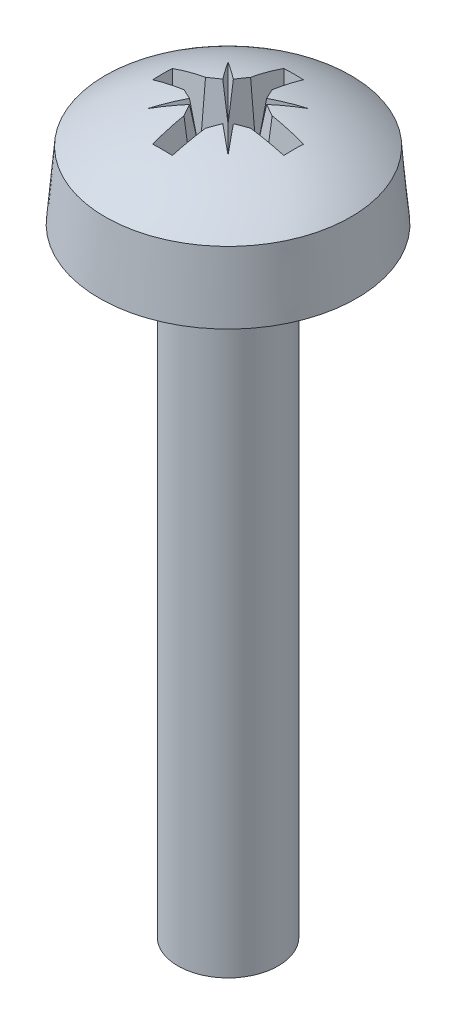
ISO-10303-21;
HEADER;
FILE_DESCRIPTION(('STEP AP214'),'2;1');
FILE_NAME('part.step','',(''),(''),'','','');
FILE_SCHEMA(('AUTOMOTIVE_DESIGN { 1 0 10303 214 1 1 1 1 }'));
ENDSEC;
DATA;
#1=APPLICATION_CONTEXT('core data for automotive mechanical design processes');
#2=APPLICATION_PROTOCOL_DEFINITION('international standard','automotive_design',2000,#1);
#3=PRODUCT_CONTEXT('',#1,'mechanical');
#4=PRODUCT('Part','Part','',(#3));
#5=PRODUCT_RELATED_PRODUCT_CATEGORY('part','',(#4));
#6=PRODUCT_DEFINITION_FORMATION('','',#4);
#7=PRODUCT_DEFINITION_CONTEXT('part definition',#1,'design');
#8=PRODUCT_DEFINITION('design','',#6,#7);
#9=PRODUCT_DEFINITION_SHAPE('','',#8);
#10=(LENGTH_UNIT() NAMED_UNIT(*) SI_UNIT(.MILLI.,.METRE.));
#11=(NAMED_UNIT(*) PLANE_ANGLE_UNIT() SI_UNIT($,.RADIAN.));
#12=(NAMED_UNIT(*) SI_UNIT($,.STERADIAN.) SOLID_ANGLE_UNIT());
#13=UNCERTAINTY_MEASURE_WITH_UNIT(LENGTH_MEASURE(1.E-05),#10,'distance_accuracy_value','');
#14=(GEOMETRIC_REPRESENTATION_CONTEXT(3) GLOBAL_UNCERTAINTY_ASSIGNED_CONTEXT((#13)) GLOBAL_UNIT_ASSIGNED_CONTEXT((#10,
#11,#12)) REPRESENTATION_CONTEXT('',''));
#15=CARTESIAN_POINT('',(0.,0.,0.));
#16=DIRECTION('',(0.,0.,1.));
#17=DIRECTION('',(1.,0.,0.));
#18=AXIS2_PLACEMENT_3D('',#15,#16,#17);
#19=CARTESIAN_POINT('',(0.974000000000002,-12.,0.));
#20=DIRECTION('',(0.,1.,0.));
#21=DIRECTION('',(-1.,0.,0.));
#22=AXIS2_PLACEMENT_3D('',#19,#20,#21);
#23=PLANE('',#22);
#24=CARTESIAN_POINT('',(0.,-12.,0.));
#25=DIRECTION('',(0.,1.,0.));
#26=DIRECTION('',(-1.,0.,0.));
#27=AXIS2_PLACEMENT_3D('',#24,#25,#26);
#28=CIRCLE('',#27,0.974);
#29=CARTESIAN_POINT('',(-0.973999999999997,-12.,0.));
#30=VERTEX_POINT('',#29);
#31=EDGE_CURVE('E307',#30,#30,#28,.T.);
#32=ORIENTED_EDGE('',*,*,#31,.F.);
#33=EDGE_LOOP('',(#32));
#34=FACE_BOUND('',#33,.T.);
#35=ADVANCED_FACE('F37',(#34),#23,.F.);
#36=CARTESIAN_POINT('',(0.,2.1,0.));
#37=DIRECTION('',(0.,1.,0.));
#38=DIRECTION('',(-1.,0.,0.));
#39=AXIS2_PLACEMENT_3D('',#36,#37,#38);
#40=CYLINDRICAL_SURFACE('',#39,0.974);
#41=CARTESIAN_POINT('',(0.,-0.900000000000001,0.));
#42=DIRECTION('',(0.,1.,0.));
#43=DIRECTION('',(-1.,0.,0.));
#44=AXIS2_PLACEMENT_3D('',#41,#42,#43);
#45=CIRCLE('',#44,0.974);
#46=CARTESIAN_POINT('',(-0.974,-0.900000000000001,0.));
#47=VERTEX_POINT('',#46);
#48=EDGE_CURVE('E304',#47,#47,#45,.T.);
#49=ORIENTED_EDGE('',*,*,#48,.F.);
#50=EDGE_LOOP('',(#49));
#51=FACE_BOUND('',#50,.T.);
#52=ORIENTED_EDGE('',*,*,#31,.T.);
#53=EDGE_LOOP('',(#52));
#54=FACE_BOUND('',#53,.T.);
#55=ADVANCED_FACE('F552',(#51,#54),#40,.T.);
#56=CARTESIAN_POINT('',(0.,-0.900000000000001,0.));
#57=DIRECTION('',(0.,1.,0.));
#58=DIRECTION('',(-1.,0.,0.));
#59=AXIS2_PLACEMENT_3D('',#56,#57,#58);
#60=CONICAL_SURFACE('',#59,0.974,0.296149679839105);
#61=CARTESIAN_POINT('',(0.,-0.00200000000000113,0.));
#62=DIRECTION('',(0.,1.,0.));
#63=DIRECTION('',(-1.,0.,0.));
#64=AXIS2_PLACEMENT_3D('',#61,#62,#63);
#65=CIRCLE('',#64,1.248);
#66=CARTESIAN_POINT('',(-1.248,-0.00200000000000136,0.));
#67=VERTEX_POINT('',#66);
#68=EDGE_CURVE('E301',#67,#67,#65,.T.);
#69=ORIENTED_EDGE('',*,*,#68,.F.);
#70=EDGE_LOOP('',(#69));
#71=FACE_BOUND('',#70,.T.);
#72=ORIENTED_EDGE('',*,*,#48,.T.);
#73=EDGE_LOOP('',(#72));
#74=FACE_BOUND('',#73,.T.);
#75=ADVANCED_FACE('F557',(#71,#74),#60,.T.);
#76=CARTESIAN_POINT('',(1.25,-0.00200000000000087,0.));
#77=DIRECTION('',(0.,1.,0.));
#78=DIRECTION('',(-1.,0.,0.));
#79=AXIS2_PLACEMENT_3D('',#76,#77,#78);
#80=PLANE('',#79);
#81=CARTESIAN_POINT('',(0.,-0.00200000000000113,0.));
#82=DIRECTION('',(0.,1.,0.));
#83=DIRECTION('',(-1.,0.,0.));
#84=AXIS2_PLACEMENT_3D('',#81,#82,#83);
#85=CIRCLE('',#84,1.25);
#86=CARTESIAN_POINT('',(-1.25,-0.00200000000000136,0.));
#87=VERTEX_POINT('',#86);
#88=EDGE_CURVE('E298',#87,#87,#85,.T.);
#89=ORIENTED_EDGE('',*,*,#88,.F.);
#90=EDGE_LOOP('',(#89));
#91=FACE_BOUND('',#90,.T.);
#92=ORIENTED_EDGE('',*,*,#68,.T.);
#93=EDGE_LOOP('',(#92));
#94=FACE_BOUND('',#93,.T.);
#95=ADVANCED_FACE('F564',(#91,#94),#80,.F.);
#96=CARTESIAN_POINT('',(0.,2.1,0.));
#97=DIRECTION('',(0.,1.,0.));
#98=DIRECTION('',(-1.,0.,0.));
#99=AXIS2_PLACEMENT_3D('',#96,#97,#98);
#100=CYLINDRICAL_SURFACE('',#99,1.25);
#101=CARTESIAN_POINT('',(0.,0.,0.));
#102=DIRECTION('',(0.,1.,0.));
#103=DIRECTION('',(-1.,0.,0.));
#104=AXIS2_PLACEMENT_3D('',#101,#102,#103);
#105=CIRCLE('',#104,1.25);
#106=CARTESIAN_POINT('',(-1.25,0.,0.));
#107=VERTEX_POINT('',#106);
#108=EDGE_CURVE('E295',#107,#107,#105,.T.);
#109=ORIENTED_EDGE('',*,*,#108,.F.);
#110=EDGE_LOOP('',(#109));
#111=FACE_BOUND('',#110,.T.);
#112=ORIENTED_EDGE('',*,*,#88,.T.);
#113=EDGE_LOOP('',(#112));
#114=FACE_BOUND('',#113,.T.);
#115=ADVANCED_FACE('F571',(#111,#114),#100,.T.);
#116=CARTESIAN_POINT('',(2.5,0.,0.));
#117=DIRECTION('',(0.,1.,0.));
#118=DIRECTION('',(-1.,0.,0.));
#119=AXIS2_PLACEMENT_3D('',#116,#117,#118);
#120=PLANE('',#119);
#121=CARTESIAN_POINT('',(0.,0.,0.));
#122=DIRECTION('',(0.,1.,0.));
#123=DIRECTION('',(-1.,0.,0.));
#124=AXIS2_PLACEMENT_3D('',#121,#122,#123);
#125=CIRCLE('',#124,2.5);
#126=CARTESIAN_POINT('',(-2.5,0.,0.));
#127=VERTEX_POINT('',#126);
#128=EDGE_CURVE('E292',#127,#127,#125,.T.);
#129=ORIENTED_EDGE('',*,*,#128,.F.);
#130=EDGE_LOOP('',(#129));
#131=FACE_BOUND('',#130,.T.);
#132=ORIENTED_EDGE('',*,*,#108,.T.);
#133=EDGE_LOOP('',(#132));
#134=FACE_BOUND('',#133,.T.);
#135=ADVANCED_FACE('F575',(#131,#134),#120,.F.);
#136=CARTESIAN_POINT('',(0.,0.,0.));
#137=DIRECTION('',(0.,-1.,0.));
#138=DIRECTION('',(1.,0.,0.));
#139=AXIS2_PLACEMENT_3D('',#136,#137,#138);
#140=CONICAL_SURFACE('',#139,2.5,0.0872664625997159);
#141=CARTESIAN_POINT('',(0.,1.31096863090063,0.));
#142=DIRECTION('',(0.,1.,0.));
#143=DIRECTION('',(-1.,0.,0.));
#144=AXIS2_PLACEMENT_3D('',#141,#142,#143);
#145=CIRCLE('',#144,2.38530510655809);
#146=CARTESIAN_POINT('',(-2.38530510655809,1.31096863090063,0.));
#147=VERTEX_POINT('',#146);
#148=EDGE_CURVE('E289',#147,#147,#145,.T.);
#149=ORIENTED_EDGE('',*,*,#148,.F.);
#150=EDGE_LOOP('',(#149));
#151=FACE_BOUND('',#150,.T.);
#152=ORIENTED_EDGE('',*,*,#128,.T.);
#153=EDGE_LOOP('',(#152));
#154=FACE_BOUND('',#153,.T.);
#155=ADVANCED_FACE('F579',(#151,#154),#140,.T.);
#156=CARTESIAN_POINT('',(0.,-1.9,0.));
#157=DIRECTION('',(0.,1.,0.));
#158=DIRECTION('',(1.,0.,0.));
#159=AXIS2_PLACEMENT_3D('',#156,#157,#158);
#160=SPHERICAL_SURFACE('',#159,4.);
#161=CARTESIAN_POINT('',(-0.00278354721914485,-1.89923902999755,0.0055373415829533));
#162=DIRECTION('',(0.445785078048498,-0.121869343405148,-0.886805236411746));
#163=DIRECTION('',(-0.893464988953191,0.,-0.449132846176801));
#164=AXIS2_PLACEMENT_3D('',#161,#162,#163);
#165=CIRCLE('',#164,3.99999512632675);
#166=CARTESIAN_POINT('',(0.426300530005417,2.06404659813842,-0.323422982956247));
#167=VERTEX_POINT('',#166);
#168=CARTESIAN_POINT('',(0.647136075268145,2.04174941228099,-0.209347727164586));
#169=VERTEX_POINT('',#168);
#170=EDGE_CURVE('E310',#167,#169,#165,.T.);
#171=ORIENTED_EDGE('',*,*,#170,.T.);
#172=CARTESIAN_POINT('',(0.,-1.86677949775066,0.27055927882996));
#173=DIRECTION('',(0.,-0.121869343405148,-0.992546151641322));
#174=DIRECTION('',(0.,0.992546151641322,-0.121869343405148));
#175=AXIS2_PLACEMENT_3D('',#172,#173,#174);
#176=CIRCLE('',#175,3.99070095031804);
#177=CARTESIAN_POINT('',(1.27384244930078,1.88696384539826,-0.190342449300782));
#178=VERTEX_POINT('',#177);
#179=EDGE_CURVE('E11',#169,#178,#176,.T.);
#180=ORIENTED_EDGE('',*,*,#179,.T.);
#181=CARTESIAN_POINT('',(0.796848430880061,-1.99784068469178,0.));
#182=DIRECTION('',(0.992546151641322,-0.121869343405148,0.));
#183=DIRECTION('',(0.121869343405148,0.992546151641322,0.));
#184=AXIS2_PLACEMENT_3D('',#181,#182,#183);
#185=CIRCLE('',#184,3.91860431513862);
#186=CARTESIAN_POINT('',(1.27384244930078,1.88696384539826,0.19034244930078));
#187=VERTEX_POINT('',#186);
#188=EDGE_CURVE('E44',#178,#187,#185,.T.);
#189=ORIENTED_EDGE('',*,*,#188,.T.);
#190=CARTESIAN_POINT('',(0.,-1.86677949775066,-0.270559278829959));
#191=DIRECTION('',(0.,-0.121869343405148,0.992546151641322));
#192=DIRECTION('',(0.,-0.992546151641322,-0.121869343405148));
#193=AXIS2_PLACEMENT_3D('',#190,#191,#192);
#194=CIRCLE('',#193,3.99070095031804);
#195=CARTESIAN_POINT('',(0.647136075268145,2.04174941228099,0.209347727164585));
#196=VERTEX_POINT('',#195);
#197=EDGE_CURVE('E385',#187,#196,#194,.T.);
#198=ORIENTED_EDGE('',*,*,#197,.T.);
#199=CARTESIAN_POINT('',(-0.00278354721914501,-1.89923902999755,-0.00553734158295361));
#200=DIRECTION('',(0.445785078048498,-0.121869343405148,0.886805236411746));
#201=DIRECTION('',(0.893464988953191,0.,-0.449132846176801));
#202=AXIS2_PLACEMENT_3D('',#199,#200,#201);
#203=CIRCLE('',#202,3.99999512632675);
#204=CARTESIAN_POINT('',(0.426300530005417,2.06404659813842,0.323422982956247));
#205=VERTEX_POINT('',#204);
#206=EDGE_CURVE('E382',#196,#205,#203,.T.);
#207=ORIENTED_EDGE('',*,*,#206,.T.);
#208=CARTESIAN_POINT('',(-0.275654934070824,-1.856277679116,0.225420166907371));
#209=DIRECTION('',(0.768346353587388,-0.121869343405148,-0.628324553130755));
#210=DIRECTION('',(-0.633043160856276,0.,-0.774116500594772));
#211=AXIS2_PLACEMENT_3D('',#208,#209,#210);
#212=CIRCLE('',#211,3.98387857048008);
#213=CARTESIAN_POINT('',(0.78313145032651,1.9436194222398,0.783131450326509));
#214=VERTEX_POINT('',#213);
#215=EDGE_CURVE('E379',#205,#214,#212,.T.);
#216=ORIENTED_EDGE('',*,*,#215,.T.);
#217=CARTESIAN_POINT('',(0.225420166907368,-1.856277679116,-0.275654934070822));
#218=DIRECTION('',(-0.628324553130752,-0.121869343405148,0.76834635358739));
#219=DIRECTION('',(0.774116500594774,0.,0.633043160856273));
#220=AXIS2_PLACEMENT_3D('',#217,#218,#219);
#221=CIRCLE('',#220,3.98387857048008);
#222=CARTESIAN_POINT('',(0.323422982956245,2.06404659813842,0.426300530005418));
#223=VERTEX_POINT('',#222);
#224=EDGE_CURVE('E376',#214,#223,#221,.T.);
#225=ORIENTED_EDGE('',*,*,#224,.T.);
#226=CARTESIAN_POINT('',(-0.00553734158295333,-1.89923902999755,-0.0027835472191466));
#227=DIRECTION('',(0.886805236411746,-0.121869343405148,0.445785078048498));
#228=DIRECTION('',(0.449132846176801,0.,-0.893464988953191));
#229=AXIS2_PLACEMENT_3D('',#226,#227,#228);
#230=CIRCLE('',#229,3.99999512632675);
#231=CARTESIAN_POINT('',(0.209347727164584,2.04174941228099,0.647136075268146));
#232=VERTEX_POINT('',#231);
#233=EDGE_CURVE('E373',#223,#232,#230,.T.);
#234=ORIENTED_EDGE('',*,*,#233,.T.);
#235=CARTESIAN_POINT('',(-0.27055927882996,-1.86677949775066,0.));
#236=DIRECTION('',(0.992546151641322,-0.121869343405148,0.));
#237=DIRECTION('',(0.121869343405148,0.992546151641322,0.));
#238=AXIS2_PLACEMENT_3D('',#235,#236,#237);
#239=CIRCLE('',#238,3.99070095031804);
#240=CARTESIAN_POINT('',(0.19034244930078,1.88696384539826,1.27384244930078));
#241=VERTEX_POINT('',#240);
#242=EDGE_CURVE('E370',#232,#241,#239,.T.);
#243=ORIENTED_EDGE('',*,*,#242,.T.);
#244=CARTESIAN_POINT('',(0.,-1.99784068469178,0.796848430880061));
#245=DIRECTION('',(0.,-0.121869343405148,0.992546151641322));
#246=DIRECTION('',(0.,-0.992546151641322,-0.121869343405148));
#247=AXIS2_PLACEMENT_3D('',#244,#245,#246);
#248=CIRCLE('',#247,3.91860431513862);
#249=CARTESIAN_POINT('',(-0.190342449300781,1.88696384539826,1.27384244930078));
#250=VERTEX_POINT('',#249);
#251=EDGE_CURVE('E367',#241,#250,#248,.T.);
#252=ORIENTED_EDGE('',*,*,#251,.T.);
#253=CARTESIAN_POINT('',(0.270559278829959,-1.86677949775066,0.));
#254=DIRECTION('',(-0.992546151641322,-0.121869343405148,0.));
#255=DIRECTION('',(0.121869343405148,-0.992546151641322,0.));
#256=AXIS2_PLACEMENT_3D('',#253,#254,#255);
#257=CIRCLE('',#256,3.99070095031804);
#258=CARTESIAN_POINT('',(-0.209347727164586,2.04174941228099,0.647136075268146));
#259=VERTEX_POINT('',#258);
#260=EDGE_CURVE('E364',#250,#259,#257,.T.);
#261=ORIENTED_EDGE('',*,*,#260,.T.);
#262=CARTESIAN_POINT('',(0.00553734158295289,-1.89923902999755,-0.00278354721914522));
#263=DIRECTION('',(-0.886805236411746,-0.121869343405148,0.445785078048498));
#264=DIRECTION('',(0.449132846176801,0.,0.893464988953191));
#265=AXIS2_PLACEMENT_3D('',#262,#263,#264);
#266=CIRCLE('',#265,3.99999512632675);
#267=CARTESIAN_POINT('',(-0.323422982956247,2.06404659813842,0.426300530005418));
#268=VERTEX_POINT('',#267);
#269=EDGE_CURVE('E361',#259,#268,#266,.T.);
#270=ORIENTED_EDGE('',*,*,#269,.T.);
#271=CARTESIAN_POINT('',(-0.225420166907367,-1.856277679116,-0.275654934070823));
#272=DIRECTION('',(0.628324553130752,-0.121869343405148,0.76834635358739));
#273=DIRECTION('',(0.774116500594774,0.,-0.633043160856273));
#274=AXIS2_PLACEMENT_3D('',#271,#272,#273);
#275=CIRCLE('',#274,3.98387857048008);
#276=CARTESIAN_POINT('',(-0.783131450326509,1.9436194222398,0.783131450326508));
#277=VERTEX_POINT('',#276);
#278=EDGE_CURVE('E358',#268,#277,#275,.T.);
#279=ORIENTED_EDGE('',*,*,#278,.T.);
#280=CARTESIAN_POINT('',(0.275654934070824,-1.856277679116,0.225420166907369));
#281=DIRECTION('',(-0.768346353587388,-0.121869343405148,-0.628324553130755));
#282=DIRECTION('',(-0.633043160856276,0.,0.774116500594772));
#283=AXIS2_PLACEMENT_3D('',#280,#281,#282);
#284=CIRCLE('',#283,3.98387857048008);
#285=CARTESIAN_POINT('',(-0.426300530005419,2.06404659813842,0.323422982956247));
#286=VERTEX_POINT('',#285);
#287=EDGE_CURVE('E355',#277,#286,#284,.T.);
#288=ORIENTED_EDGE('',*,*,#287,.T.);
#289=CARTESIAN_POINT('',(0.00278354721914659,-1.89923902999755,-0.00553734158295217));
#290=DIRECTION('',(-0.445785078048498,-0.121869343405148,0.886805236411746));
#291=DIRECTION('',(0.893464988953191,0.,0.449132846176801));
#292=AXIS2_PLACEMENT_3D('',#289,#290,#291);
#293=CIRCLE('',#292,3.99999512632675);
#294=CARTESIAN_POINT('',(-0.647136075268147,2.04174941228099,0.209347727164585));
#295=VERTEX_POINT('',#294);
#296=EDGE_CURVE('E352',#286,#295,#293,.T.);
#297=ORIENTED_EDGE('',*,*,#296,.T.);
#298=CARTESIAN_POINT('',(0.,-1.86677949775066,-0.270559278829959));
#299=DIRECTION('',(0.,-0.121869343405148,0.992546151641322));
#300=DIRECTION('',(0.,-0.992546151641322,-0.121869343405148));
#301=AXIS2_PLACEMENT_3D('',#298,#299,#300);
#302=CIRCLE('',#301,3.99070095031804);
#303=CARTESIAN_POINT('',(-1.27384244930078,1.88696384539826,0.19034244930078));
#304=VERTEX_POINT('',#303);
#305=EDGE_CURVE('E349',#295,#304,#302,.T.);
#306=ORIENTED_EDGE('',*,*,#305,.T.);
#307=CARTESIAN_POINT('',(-0.796848430880063,-1.99784068469178,0.));
#308=DIRECTION('',(-0.992546151641322,-0.121869343405148,0.));
#309=DIRECTION('',(0.121869343405148,-0.992546151641322,0.));
#310=AXIS2_PLACEMENT_3D('',#307,#308,#309);
#311=CIRCLE('',#310,3.91860431513862);
#312=CARTESIAN_POINT('',(-1.27384244930078,1.88696384539826,-0.19034244930078));
#313=VERTEX_POINT('',#312);
#314=EDGE_CURVE('E346',#304,#313,#311,.T.);
#315=ORIENTED_EDGE('',*,*,#314,.T.);
#316=CARTESIAN_POINT('',(0.,-1.86677949775066,0.270559278829959));
#317=DIRECTION('',(0.,-0.121869343405148,-0.992546151641322));
#318=DIRECTION('',(0.,0.992546151641322,-0.121869343405148));
#319=AXIS2_PLACEMENT_3D('',#316,#317,#318);
#320=CIRCLE('',#319,3.99070095031804);
#321=CARTESIAN_POINT('',(-0.647136075268147,2.04174941228099,-0.209347727164585));
#322=VERTEX_POINT('',#321);
#323=EDGE_CURVE('E343',#313,#322,#320,.T.);
#324=ORIENTED_EDGE('',*,*,#323,.T.);
#325=CARTESIAN_POINT('',(0.00278354721914642,-1.89923902999755,0.00553734158295184));
#326=DIRECTION('',(-0.445785078048498,-0.121869343405148,-0.886805236411746));
#327=DIRECTION('',(-0.893464988953191,0.,0.449132846176801));
#328=AXIS2_PLACEMENT_3D('',#325,#326,#327);
#329=CIRCLE('',#328,3.99999512632675);
#330=CARTESIAN_POINT('',(-0.426300530005419,2.06404659813842,-0.323422982956247));
#331=VERTEX_POINT('',#330);
#332=EDGE_CURVE('E340',#322,#331,#329,.T.);
#333=ORIENTED_EDGE('',*,*,#332,.T.);
#334=CARTESIAN_POINT('',(0.275654934070824,-1.856277679116,-0.225420166907368));
#335=DIRECTION('',(-0.768346353587389,-0.121869343405148,0.628324553130754));
#336=DIRECTION('',(0.633043160856274,0.,0.774116500594773));
#337=AXIS2_PLACEMENT_3D('',#334,#335,#336);
#338=CIRCLE('',#337,3.98387857048008);
#339=CARTESIAN_POINT('',(-0.78313145032651,1.9436194222398,-0.783131450326509));
#340=VERTEX_POINT('',#339);
#341=EDGE_CURVE('E337',#331,#340,#338,.T.);
#342=ORIENTED_EDGE('',*,*,#341,.T.);
#343=CARTESIAN_POINT('',(-0.225420166907368,-1.856277679116,0.275654934070823));
#344=DIRECTION('',(0.628324553130754,-0.121869343405148,-0.768346353587389));
#345=DIRECTION('',(-0.774116500594773,0.,-0.633043160856275));
#346=AXIS2_PLACEMENT_3D('',#343,#344,#345);
#347=CIRCLE('',#346,3.98387857048008);
#348=CARTESIAN_POINT('',(-0.323422982956247,2.06404659813842,-0.426300530005418));
#349=VERTEX_POINT('',#348);
#350=EDGE_CURVE('E334',#340,#349,#347,.T.);
#351=ORIENTED_EDGE('',*,*,#350,.T.);
#352=CARTESIAN_POINT('',(0.00553734158295279,-1.89923902999755,0.00278354721914517));
#353=DIRECTION('',(-0.886805236411746,-0.121869343405148,-0.445785078048497));
#354=DIRECTION('',(-0.449132846176801,0.,0.893464988953191));
#355=AXIS2_PLACEMENT_3D('',#352,#353,#354);
#356=CIRCLE('',#355,3.99999512632675);
#357=CARTESIAN_POINT('',(-0.209347727164586,2.04174941228099,-0.647136075268146));
#358=VERTEX_POINT('',#357);
#359=EDGE_CURVE('E331',#349,#358,#356,.T.);
#360=ORIENTED_EDGE('',*,*,#359,.T.);
#361=CARTESIAN_POINT('',(0.27055927882996,-1.86677949775066,0.));
#362=DIRECTION('',(-0.992546151641322,-0.121869343405148,0.));
#363=DIRECTION('',(0.121869343405148,-0.992546151641322,0.));
#364=AXIS2_PLACEMENT_3D('',#361,#362,#363);
#365=CIRCLE('',#364,3.99070095031804);
#366=CARTESIAN_POINT('',(-0.190342449300781,1.88696384539826,-1.27384244930078));
#367=VERTEX_POINT('',#366);
#368=EDGE_CURVE('E328',#358,#367,#365,.T.);
#369=ORIENTED_EDGE('',*,*,#368,.T.);
#370=CARTESIAN_POINT('',(0.,-1.99784068469178,-0.796848430880062));
#371=DIRECTION('',(0.,-0.121869343405148,-0.992546151641322));
#372=DIRECTION('',(0.,0.992546151641322,-0.121869343405148));
#373=AXIS2_PLACEMENT_3D('',#370,#371,#372);
#374=CIRCLE('',#373,3.91860431513862);
#375=CARTESIAN_POINT('',(0.19034244930078,1.88696384539826,-1.27384244930078));
#376=VERTEX_POINT('',#375);
#377=EDGE_CURVE('E325',#367,#376,#374,.T.);
#378=ORIENTED_EDGE('',*,*,#377,.T.);
#379=CARTESIAN_POINT('',(-0.270559278829961,-1.86677949775066,0.));
#380=DIRECTION('',(0.992546151641322,-0.121869343405148,0.));
#381=DIRECTION('',(0.121869343405148,0.992546151641322,0.));
#382=AXIS2_PLACEMENT_3D('',#379,#380,#381);
#383=CIRCLE('',#382,3.99070095031804);
#384=CARTESIAN_POINT('',(0.209347727164584,2.04174941228099,-0.647136075268146));
#385=VERTEX_POINT('',#384);
#386=EDGE_CURVE('E322',#376,#385,#383,.T.);
#387=ORIENTED_EDGE('',*,*,#386,.T.);
#388=CARTESIAN_POINT('',(-0.00553734158295323,-1.89923902999755,0.00278354721914654));
#389=DIRECTION('',(0.886805236411746,-0.121869343405148,-0.445785078048497));
#390=DIRECTION('',(-0.449132846176801,0.,-0.893464988953191));
#391=AXIS2_PLACEMENT_3D('',#388,#389,#390);
#392=CIRCLE('',#391,3.99999512632675);
#393=CARTESIAN_POINT('',(0.323422982956245,2.06404659813842,-0.426300530005419));
#394=VERTEX_POINT('',#393);
#395=EDGE_CURVE('E319',#385,#394,#392,.T.);
#396=ORIENTED_EDGE('',*,*,#395,.T.);
#397=CARTESIAN_POINT('',(0.225420166907369,-1.856277679116,0.275654934070822));
#398=DIRECTION('',(-0.628324553130754,-0.121869343405148,-0.768346353587389));
#399=DIRECTION('',(-0.774116500594773,0.,0.633043160856275));
#400=AXIS2_PLACEMENT_3D('',#397,#398,#399);
#401=CIRCLE('',#400,3.98387857048008);
#402=CARTESIAN_POINT('',(0.783131450326509,1.9436194222398,-0.783131450326511));
#403=VERTEX_POINT('',#402);
#404=EDGE_CURVE('E316',#394,#403,#401,.T.);
#405=ORIENTED_EDGE('',*,*,#404,.T.);
#406=CARTESIAN_POINT('',(-0.275654934070823,-1.856277679116,-0.22542016690737));
#407=DIRECTION('',(0.768346353587389,-0.121869343405148,0.628324553130754));
#408=DIRECTION('',(0.633043160856274,0.,-0.774116500594773));
#409=AXIS2_PLACEMENT_3D('',#406,#407,#408);
#410=CIRCLE('',#409,3.98387857048008);
#411=EDGE_CURVE('E313',#403,#167,#410,.T.);
#412=ORIENTED_EDGE('',*,*,#411,.T.);
#413=EDGE_LOOP('',(#171,#180,#189,#198,#207,#216,#225,#234,#243,#252,#261,#270,#279,#288,#297,
#306,#315,#324,#333,#342,#351,#360,#369,#378,#387,#396,#405,#412));
#414=FACE_BOUND('',#413,.T.);
#415=ORIENTED_EDGE('',*,*,#148,.T.);
#416=EDGE_LOOP('',(#415));
#417=FACE_BOUND('',#416,.T.);
#418=ADVANCED_FACE('F388',(#414,#417),#160,.T.);
#419=CARTESIAN_POINT('',(1.3,2.1,-0.2165));
#420=DIRECTION('',(0.,-0.121869343405148,-0.992546151641322));
#421=DIRECTION('',(0.,0.992546151641322,-0.121869343405148));
#422=AXIS2_PLACEMENT_3D('',#419,#420,#421);
#423=PLANE('',#422);
#424=DIRECTION('',(0.0288955274367926,0.992131701159773,-0.121818455284755));
#425=VECTOR('',#424,1.);
#426=CARTESIAN_POINT('',(0.648832605530887,2.1,-0.2165));
#427=LINE('',#426,#425);
#428=CARTESIAN_POINT('',(0.612135497145178,0.84,-0.0617914532623397));
#429=VERTEX_POINT('',#428);
#430=EDGE_CURVE('E51',#429,#169,#427,.T.);
#431=ORIENTED_EDGE('',*,*,#430,.F.);
#432=DIRECTION('',(-1.,0.,0.));
#433=VECTOR('',#432,1.);
#434=CARTESIAN_POINT('',(-1.3,0.84,-0.0617914532623397));
#435=LINE('',#434,#433);
#436=CARTESIAN_POINT('',(1.14529145326234,0.84,-0.0617914532623397));
#437=VERTEX_POINT('',#436);
#438=EDGE_CURVE('E217',#437,#429,#435,.T.);
#439=ORIENTED_EDGE('',*,*,#438,.F.);
#440=DIRECTION('',(0.120974291151355,0.985256536015293,-0.120974291151355));
#441=VECTOR('',#440,1.);
#442=CARTESIAN_POINT('',(1.3,2.1,-0.2165));
#443=LINE('',#442,#441);
#444=EDGE_CURVE('E207',#437,#178,#443,.T.);
#445=ORIENTED_EDGE('',*,*,#444,.T.);
#446=ORIENTED_EDGE('',*,*,#179,.F.);
#447=EDGE_LOOP('',(#431,#439,#445,#446));
#448=FACE_BOUND('',#447,.T.);
#449=ADVANCED_FACE('F218',(#448),#423,.F.);
#450=CARTESIAN_POINT('',(1.3,2.1,-0.2165));
#451=DIRECTION('',(0.992546151641322,-0.121869343405148,0.));
#452=DIRECTION('',(0.121869343405148,0.992546151641322,0.));
#453=AXIS2_PLACEMENT_3D('',#450,#451,#452);
#454=PLANE('',#453);
#455=ORIENTED_EDGE('',*,*,#444,.F.);
#456=DIRECTION('',(0.,0.,-1.));
#457=VECTOR('',#456,1.);
#458=CARTESIAN_POINT('',(1.14529145326234,0.84,-0.2165));
#459=LINE('',#458,#457);
#460=CARTESIAN_POINT('',(1.14529145326234,0.84,0.0617914532623381));
#461=VERTEX_POINT('',#460);
#462=EDGE_CURVE('E211',#461,#437,#459,.T.);
#463=ORIENTED_EDGE('',*,*,#462,.F.);
#464=DIRECTION('',(0.120974291151355,0.985256536015293,0.120974291151355));
#465=VECTOR('',#464,1.);
#466=CARTESIAN_POINT('',(1.3,2.1,0.216499999999998));
#467=LINE('',#466,#465);
#468=EDGE_CURVE('E214',#461,#187,#467,.T.);
#469=ORIENTED_EDGE('',*,*,#468,.T.);
#470=ORIENTED_EDGE('',*,*,#188,.F.);
#471=EDGE_LOOP('',(#455,#463,#469,#470));
#472=FACE_BOUND('',#471,.T.);
#473=ADVANCED_FACE('F209',(#472),#454,.F.);
#474=CARTESIAN_POINT('',(1.3,2.1,0.216499999999998));
#475=DIRECTION('',(0.,-0.121869343405148,0.992546151641322));
#476=DIRECTION('',(0.,-0.992546151641322,-0.121869343405148));
#477=AXIS2_PLACEMENT_3D('',#474,#475,#476);
#478=PLANE('',#477);
#479=ORIENTED_EDGE('',*,*,#468,.F.);
#480=DIRECTION('',(1.,0.,0.));
#481=VECTOR('',#480,1.);
#482=CARTESIAN_POINT('',(-1.3,0.84,0.0617914532623429));
#483=LINE('',#482,#481);
#484=CARTESIAN_POINT('',(0.612135497145178,0.84,0.0617914532623391));
#485=VERTEX_POINT('',#484);
#486=EDGE_CURVE('E227',#485,#461,#483,.T.);
#487=ORIENTED_EDGE('',*,*,#486,.F.);
#488=DIRECTION('',(0.0288955274367927,0.992131701159773,0.121818455284755));
#489=VECTOR('',#488,1.);
#490=CARTESIAN_POINT('',(0.64937629872746,2.11866777677634,0.218792114774516));
#491=LINE('',#490,#489);
#492=EDGE_CURVE('E467',#485,#196,#491,.T.);
#493=ORIENTED_EDGE('',*,*,#492,.T.);
#494=ORIENTED_EDGE('',*,*,#197,.F.);
#495=EDGE_LOOP('',(#479,#487,#493,#494));
#496=FACE_BOUND('',#495,.T.);
#497=ADVANCED_FACE('F470',(#496),#478,.F.);
#498=CARTESIAN_POINT('',(0.648832605530888,2.1,0.216499999999999));
#499=DIRECTION('',(0.445785078048498,-0.121869343405148,0.886805236411746));
#500=DIRECTION('',(0.893464988953191,0.,-0.449132846176801));
#501=AXIS2_PLACEMENT_3D('',#498,#499,#500);
#502=PLANE('',#501);
#503=ORIENTED_EDGE('',*,*,#492,.F.);
#504=DIRECTION('',(0.893464988953191,0.,-0.449132846176801));
#505=VECTOR('',#504,1.);
#506=CARTESIAN_POINT('',(-0.802609388745536,0.84,0.772964700194637));
#507=LINE('',#506,#505);
#508=CARTESIAN_POINT('',(0.245895419720483,0.84,0.245895419720484));
#509=VERTEX_POINT('',#508);
#510=EDGE_CURVE('E231',#509,#485,#507,.T.);
#511=ORIENTED_EDGE('',*,*,#510,.F.);
#512=DIRECTION('',(0.0906975547004325,0.991739838436837,0.0906975547004326));
#513=VECTOR('',#512,1.);
#514=CARTESIAN_POINT('',(0.362303148220355,2.11286983906648,0.362303148220357));
#515=LINE('',#514,#513);
#516=CARTESIAN_POINT('',(0.295597065693774,1.38346671760227,0.295597065693775));
#517=VERTEX_POINT('',#516);
#518=EDGE_CURVE('E213',#509,#517,#515,.T.);
#519=ORIENTED_EDGE('',*,*,#518,.T.);
#520=DIRECTION('',(0.18844885410931,0.981263192160575,0.0401195350886051));
#521=VECTOR('',#520,1.);
#522=CARTESIAN_POINT('',(0.440043344384033,2.13560616251024,0.326348738733776));
#523=LINE('',#522,#521);
#524=EDGE_CURVE('E464',#517,#205,#523,.T.);
#525=ORIENTED_EDGE('',*,*,#524,.T.);
#526=ORIENTED_EDGE('',*,*,#206,.F.);
#527=EDGE_LOOP('',(#503,#511,#519,#525,#526));
#528=FACE_BOUND('',#527,.T.);
#529=ADVANCED_FACE('F473',(#528),#502,.F.);
#530=CARTESIAN_POINT('',(0.433205280368291,2.1,0.32489295938975));
#531=DIRECTION('',(0.768346353587388,-0.121869343405148,-0.628324553130755));
#532=DIRECTION('',(-0.633043160856276,0.,-0.774116500594772));
#533=AXIS2_PLACEMENT_3D('',#530,#531,#532);
#534=PLANE('',#533);
#535=ORIENTED_EDGE('',*,*,#524,.F.);
#536=DIRECTION('',(0.548814154788285,0.630560105785358,0.548814154788283));
#537=VECTOR('',#536,1.);
#538=CARTESIAN_POINT('',(0.593831809406258,1.72612357129942,0.593831809406259));
#539=LINE('',#538,#537);
#540=EDGE_CURVE('E461',#517,#214,#539,.T.);
#541=ORIENTED_EDGE('',*,*,#540,.T.);
#542=ORIENTED_EDGE('',*,*,#215,.F.);
#543=EDGE_LOOP('',(#535,#541,#542));
#544=FACE_BOUND('',#543,.T.);
#545=ADVANCED_FACE('F476',(#544),#534,.F.);
#546=CARTESIAN_POINT('',(0.324892959389749,2.1,0.433205280368293));
#547=DIRECTION('',(-0.628324553130752,-0.121869343405148,0.76834635358739));
#548=DIRECTION('',(0.774116500594774,0.,0.633043160856273));
#549=AXIS2_PLACEMENT_3D('',#546,#547,#548);
#550=PLANE('',#549);
#551=ORIENTED_EDGE('',*,*,#540,.F.);
#552=DIRECTION('',(0.0401195350886054,0.981263192160575,0.18844885410931));
#553=VECTOR('',#552,1.);
#554=CARTESIAN_POINT('',(0.324892959389749,2.1,0.433205280368293));
#555=LINE('',#554,#553);
#556=EDGE_CURVE('E458',#517,#223,#555,.T.);
#557=ORIENTED_EDGE('',*,*,#556,.T.);
#558=ORIENTED_EDGE('',*,*,#224,.F.);
#559=EDGE_LOOP('',(#551,#557,#558));
#560=FACE_BOUND('',#559,.T.);
#561=ADVANCED_FACE('F480',(#560),#550,.F.);
#562=CARTESIAN_POINT('',(0.216499999999998,2.1,0.648832605530888));
#563=DIRECTION('',(0.886805236411746,-0.121869343405148,0.445785078048498));
#564=DIRECTION('',(0.449132846176801,0.,-0.893464988953191));
#565=AXIS2_PLACEMENT_3D('',#562,#563,#564);
#566=PLANE('',#565);
#567=ORIENTED_EDGE('',*,*,#556,.F.);
#568=ORIENTED_EDGE('',*,*,#518,.F.);
#569=DIRECTION('',(0.449132846176801,0.,-0.893464988953191));
#570=VECTOR('',#569,1.);
#571=CARTESIAN_POINT('',(0.119609013520501,0.84,0.497118378541868));
#572=LINE('',#571,#570);
#573=CARTESIAN_POINT('',(0.0617914532623383,0.84,0.612135497145178));
#574=VERTEX_POINT('',#573);
#575=EDGE_CURVE('E236',#574,#509,#572,.T.);
#576=ORIENTED_EDGE('',*,*,#575,.F.);
#577=DIRECTION('',(0.121818455284755,0.992131701159773,0.0288955274367927));
#578=VECTOR('',#577,1.);
#579=CARTESIAN_POINT('',(0.216499999999998,2.1,0.648832605530888));
#580=LINE('',#579,#578);
#581=EDGE_CURVE('E455',#574,#232,#580,.T.);
#582=ORIENTED_EDGE('',*,*,#581,.T.);
#583=ORIENTED_EDGE('',*,*,#233,.F.);
#584=EDGE_LOOP('',(#567,#568,#576,#582,#583));
#585=FACE_BOUND('',#584,.T.);
#586=ADVANCED_FACE('F482',(#585),#566,.F.);
#587=CARTESIAN_POINT('',(0.216499999999997,2.1,1.3));
#588=DIRECTION('',(0.992546151641322,-0.121869343405148,0.));
#589=DIRECTION('',(0.121869343405148,0.992546151641322,0.));
#590=AXIS2_PLACEMENT_3D('',#587,#588,#589);
#591=PLANE('',#590);
#592=ORIENTED_EDGE('',*,*,#581,.F.);
#593=DIRECTION('',(0.,0.,-1.));
#594=VECTOR('',#593,1.);
#595=CARTESIAN_POINT('',(0.0617914532623392,0.84,-0.216499999999998));
#596=LINE('',#595,#594);
#597=CARTESIAN_POINT('',(0.0617914532623376,0.84,1.14529145326234));
#598=VERTEX_POINT('',#597);
#599=EDGE_CURVE('E239',#598,#574,#596,.T.);
#600=ORIENTED_EDGE('',*,*,#599,.F.);
#601=DIRECTION('',(0.120974291151355,0.985256536015293,0.120974291151355));
#602=VECTOR('',#601,1.);
#603=CARTESIAN_POINT('',(0.216499999999997,2.1,1.3));
#604=LINE('',#603,#602);
#605=EDGE_CURVE('E452',#598,#241,#604,.T.);
#606=ORIENTED_EDGE('',*,*,#605,.T.);
#607=ORIENTED_EDGE('',*,*,#242,.F.);
#608=EDGE_LOOP('',(#592,#600,#606,#607));
#609=FACE_BOUND('',#608,.T.);
#610=ADVANCED_FACE('F485',(#609),#591,.F.);
#611=CARTESIAN_POINT('',(0.216499999999997,2.1,1.3));
#612=DIRECTION('',(0.,-0.121869343405148,0.992546151641322));
#613=DIRECTION('',(0.,-0.992546151641322,-0.121869343405148));
#614=AXIS2_PLACEMENT_3D('',#611,#612,#613);
#615=PLANE('',#614);
#616=ORIENTED_EDGE('',*,*,#605,.F.);
#617=DIRECTION('',(1.,0.,0.));
#618=VECTOR('',#617,1.);
#619=CARTESIAN_POINT('',(-1.3,0.84,1.14529145326234));
#620=LINE('',#619,#618);
#621=CARTESIAN_POINT('',(-0.0617914532623392,0.84,1.14529145326234));
#622=VERTEX_POINT('',#621);
#623=EDGE_CURVE('E242',#622,#598,#620,.T.);
#624=ORIENTED_EDGE('',*,*,#623,.F.);
#625=DIRECTION('',(-0.120974291151355,0.985256536015293,0.120974291151355));
#626=VECTOR('',#625,1.);
#627=CARTESIAN_POINT('',(-0.216499999999999,2.1,1.3));
#628=LINE('',#627,#626);
#629=EDGE_CURVE('E449',#622,#250,#628,.T.);
#630=ORIENTED_EDGE('',*,*,#629,.T.);
#631=ORIENTED_EDGE('',*,*,#251,.F.);
#632=EDGE_LOOP('',(#616,#624,#630,#631));
#633=FACE_BOUND('',#632,.T.);
#634=ADVANCED_FACE('F489',(#633),#615,.F.);
#635=CARTESIAN_POINT('',(-0.216499999999999,2.1,1.3));
#636=DIRECTION('',(-0.992546151641322,-0.121869343405148,0.));
#637=DIRECTION('',(0.121869343405148,-0.992546151641322,0.));
#638=AXIS2_PLACEMENT_3D('',#635,#636,#637);
#639=PLANE('',#638);
#640=ORIENTED_EDGE('',*,*,#629,.F.);
#641=DIRECTION('',(0.,0.,1.));
#642=VECTOR('',#641,1.);
#643=CARTESIAN_POINT('',(-0.0617914532623409,0.84,-0.216500000000002));
#644=LINE('',#643,#642);
#645=CARTESIAN_POINT('',(-0.0617914532623399,0.84,0.612135497145178));
#646=VERTEX_POINT('',#645);
#647=EDGE_CURVE('E245',#646,#622,#644,.T.);
#648=ORIENTED_EDGE('',*,*,#647,.F.);
#649=DIRECTION('',(-0.121818455284755,0.992131701159773,0.0288955274367928));
#650=VECTOR('',#649,1.);
#651=CARTESIAN_POINT('',(-0.218792114774516,2.11866777677634,0.649376298727461));
#652=LINE('',#651,#650);
#653=EDGE_CURVE('E446',#646,#259,#652,.T.);
#654=ORIENTED_EDGE('',*,*,#653,.T.);
#655=ORIENTED_EDGE('',*,*,#260,.F.);
#656=EDGE_LOOP('',(#640,#648,#654,#655));
#657=FACE_BOUND('',#656,.T.);
#658=ADVANCED_FACE('F492',(#657),#639,.F.);
#659=CARTESIAN_POINT('',(-0.2165,2.1,0.648832605530888));
#660=DIRECTION('',(-0.886805236411746,-0.121869343405148,0.445785078048498));
#661=DIRECTION('',(0.449132846176801,0.,0.893464988953191));
#662=AXIS2_PLACEMENT_3D('',#659,#660,#661);
#663=PLANE('',#662);
#664=ORIENTED_EDGE('',*,*,#653,.F.);
#665=DIRECTION('',(0.449132846176801,0.,0.893464988953191));
#666=VECTOR('',#665,1.);
#667=CARTESIAN_POINT('',(-0.644081828659175,0.84,-0.546221252422597));
#668=LINE('',#667,#666);
#669=CARTESIAN_POINT('',(-0.245895419720484,0.84,0.245895419720485));
#670=VERTEX_POINT('',#669);
#671=EDGE_CURVE('E248',#670,#646,#668,.T.);
#672=ORIENTED_EDGE('',*,*,#671,.F.);
#673=DIRECTION('',(-0.0906975547004327,0.991739838436837,0.0906975547004326));
#674=VECTOR('',#673,1.);
#675=CARTESIAN_POINT('',(-0.362303148220357,2.11286983906648,0.362303148220357));
#676=LINE('',#675,#674);
#677=CARTESIAN_POINT('',(-0.295597065693775,1.38346671760227,0.295597065693775));
#678=VERTEX_POINT('',#677);
#679=EDGE_CURVE('E283',#670,#678,#676,.T.);
#680=ORIENTED_EDGE('',*,*,#679,.T.);
#681=DIRECTION('',(-0.0401195350886055,0.981263192160575,0.18844885410931));
#682=VECTOR('',#681,1.);
#683=CARTESIAN_POINT('',(-0.326348738733776,2.13560616251024,0.440043344384034));
#684=LINE('',#683,#682);
#685=EDGE_CURVE('E443',#678,#268,#684,.T.);
#686=ORIENTED_EDGE('',*,*,#685,.T.);
#687=ORIENTED_EDGE('',*,*,#269,.F.);
#688=EDGE_LOOP('',(#664,#672,#680,#686,#687));
#689=FACE_BOUND('',#688,.T.);
#690=ADVANCED_FACE('F494',(#689),#663,.F.);
#691=CARTESIAN_POINT('',(-0.324892959389751,2.1,0.433205280368293));
#692=DIRECTION('',(0.628324553130752,-0.121869343405148,0.76834635358739));
#693=DIRECTION('',(0.774116500594774,0.,-0.633043160856273));
#694=AXIS2_PLACEMENT_3D('',#691,#692,#693);
#695=PLANE('',#694);
#696=ORIENTED_EDGE('',*,*,#685,.F.);
#697=DIRECTION('',(-0.548814154788285,0.630560105785358,0.548814154788283));
#698=VECTOR('',#697,1.);
#699=CARTESIAN_POINT('',(-0.59383180940626,1.72612357129942,0.593831809406259));
#700=LINE('',#699,#698);
#701=EDGE_CURVE('E440',#678,#277,#700,.T.);
#702=ORIENTED_EDGE('',*,*,#701,.T.);
#703=ORIENTED_EDGE('',*,*,#278,.F.);
#704=EDGE_LOOP('',(#696,#702,#703));
#705=FACE_BOUND('',#704,.T.);
#706=ADVANCED_FACE('F499',(#705),#695,.F.);
#707=CARTESIAN_POINT('',(-0.433205280368293,2.1,0.32489295938975));
#708=DIRECTION('',(-0.768346353587388,-0.121869343405148,-0.628324553130755));
#709=DIRECTION('',(-0.633043160856276,0.,0.774116500594772));
#710=AXIS2_PLACEMENT_3D('',#707,#708,#709);
#711=PLANE('',#710);
#712=ORIENTED_EDGE('',*,*,#701,.F.);
#713=DIRECTION('',(-0.18844885410931,0.981263192160575,0.0401195350886051));
#714=VECTOR('',#713,1.);
#715=CARTESIAN_POINT('',(-0.433205280368293,2.1,0.32489295938975));
#716=LINE('',#715,#714);
#717=EDGE_CURVE('E437',#678,#286,#716,.T.);
#718=ORIENTED_EDGE('',*,*,#717,.T.);
#719=ORIENTED_EDGE('',*,*,#287,.F.);
#720=EDGE_LOOP('',(#712,#718,#719));
#721=FACE_BOUND('',#720,.T.);
#722=ADVANCED_FACE('F502',(#721),#711,.F.);
#723=CARTESIAN_POINT('',(-0.64883260553089,2.1,0.216499999999999));
#724=DIRECTION('',(-0.445785078048498,-0.121869343405148,0.886805236411746));
#725=DIRECTION('',(0.893464988953191,0.,0.449132846176801));
#726=AXIS2_PLACEMENT_3D('',#723,#724,#725);
#727=PLANE('',#726);
#728=ORIENTED_EDGE('',*,*,#717,.F.);
#729=ORIENTED_EDGE('',*,*,#679,.F.);
#730=DIRECTION('',(0.893464988953191,0.,0.449132846176801));
#731=VECTOR('',#730,1.);
#732=CARTESIAN_POINT('',(-1.27291779611579,0.84,-0.270374930769829));
#733=LINE('',#732,#731);
#734=CARTESIAN_POINT('',(-0.61213549714518,0.84,0.0617914532623392));
#735=VERTEX_POINT('',#734);
#736=EDGE_CURVE('E251',#735,#670,#733,.T.);
#737=ORIENTED_EDGE('',*,*,#736,.F.);
#738=DIRECTION('',(-0.0288955274367928,0.992131701159773,0.121818455284755));
#739=VECTOR('',#738,1.);
#740=CARTESIAN_POINT('',(-0.64883260553089,2.1,0.216499999999999));
#741=LINE('',#740,#739);
#742=EDGE_CURVE('E434',#735,#295,#741,.T.);
#743=ORIENTED_EDGE('',*,*,#742,.T.);
#744=ORIENTED_EDGE('',*,*,#296,.F.);
#745=EDGE_LOOP('',(#728,#729,#737,#743,#744));
#746=FACE_BOUND('',#745,.T.);
#747=ADVANCED_FACE('F504',(#746),#727,.F.);
#748=CARTESIAN_POINT('',(-1.3,2.1,0.216499999999998));
#749=DIRECTION('',(0.,-0.121869343405148,0.992546151641322));
#750=DIRECTION('',(0.,-0.992546151641322,-0.121869343405148));
#751=AXIS2_PLACEMENT_3D('',#748,#749,#750);
#752=PLANE('',#751);
#753=ORIENTED_EDGE('',*,*,#742,.F.);
#754=DIRECTION('',(1.,0.,0.));
#755=VECTOR('',#754,1.);
#756=CARTESIAN_POINT('',(-1.3,0.84,0.0617914532623378));
#757=LINE('',#756,#755);
#758=CARTESIAN_POINT('',(-1.14529145326234,0.84,0.0617914532623381));
#759=VERTEX_POINT('',#758);
#760=EDGE_CURVE('E254',#759,#735,#757,.T.);
#761=ORIENTED_EDGE('',*,*,#760,.F.);
#762=DIRECTION('',(-0.120974291151355,0.985256536015293,0.120974291151355));
#763=VECTOR('',#762,1.);
#764=CARTESIAN_POINT('',(-1.29366314064123,2.04839042211678,0.210163140641223));
#765=LINE('',#764,#763);
#766=EDGE_CURVE('E431',#759,#304,#765,.T.);
#767=ORIENTED_EDGE('',*,*,#766,.T.);
#768=ORIENTED_EDGE('',*,*,#305,.F.);
#769=EDGE_LOOP('',(#753,#761,#767,#768));
#770=FACE_BOUND('',#769,.T.);
#771=ADVANCED_FACE('F507',(#770),#752,.F.);
#772=CARTESIAN_POINT('',(-1.3,2.1,-0.216499999999998));
#773=DIRECTION('',(-0.992546151641322,-0.121869343405148,0.));
#774=DIRECTION('',(0.121869343405148,-0.992546151641322,0.));
#775=AXIS2_PLACEMENT_3D('',#772,#773,#774);
#776=PLANE('',#775);
#777=ORIENTED_EDGE('',*,*,#766,.F.);
#778=DIRECTION('',(0.,0.,1.));
#779=VECTOR('',#778,1.);
#780=CARTESIAN_POINT('',(-1.14529145326234,0.84,-0.2165));
#781=LINE('',#780,#779);
#782=CARTESIAN_POINT('',(-1.14529145326234,0.84,-0.0617914532623386));
#783=VERTEX_POINT('',#782);
#784=EDGE_CURVE('E257',#783,#759,#781,.T.);
#785=ORIENTED_EDGE('',*,*,#784,.F.);
#786=DIRECTION('',(-0.120974291151355,0.985256536015293,-0.120974291151355));
#787=VECTOR('',#786,1.);
#788=CARTESIAN_POINT('',(-1.3,2.1,-0.216499999999998));
#789=LINE('',#788,#787);
#790=EDGE_CURVE('E428',#783,#313,#789,.T.);
#791=ORIENTED_EDGE('',*,*,#790,.T.);
#792=ORIENTED_EDGE('',*,*,#314,.F.);
#793=EDGE_LOOP('',(#777,#785,#791,#792));
#794=FACE_BOUND('',#793,.T.);
#795=ADVANCED_FACE('F511',(#794),#776,.F.);
#796=CARTESIAN_POINT('',(-1.3,2.1,-0.216499999999998));
#797=DIRECTION('',(0.,-0.121869343405148,-0.992546151641322));
#798=DIRECTION('',(0.,0.992546151641322,-0.121869343405148));
#799=AXIS2_PLACEMENT_3D('',#796,#797,#798);
#800=PLANE('',#799);
#801=ORIENTED_EDGE('',*,*,#790,.F.);
#802=DIRECTION('',(-1.,0.,0.));
#803=VECTOR('',#802,1.);
#804=CARTESIAN_POINT('',(-1.3,0.84,-0.0617914532623382));
#805=LINE('',#804,#803);
#806=CARTESIAN_POINT('',(-0.61213549714518,0.84,-0.0617914532623396));
#807=VERTEX_POINT('',#806);
#808=EDGE_CURVE('E260',#807,#783,#805,.T.);
#809=ORIENTED_EDGE('',*,*,#808,.F.);
#810=DIRECTION('',(-0.0288955274367928,0.992131701159773,-0.121818455284755));
#811=VECTOR('',#810,1.);
#812=CARTESIAN_POINT('',(-0.649376298727462,2.11866777677634,-0.218792114774516));
#813=LINE('',#812,#811);
#814=EDGE_CURVE('E425',#807,#322,#813,.T.);
#815=ORIENTED_EDGE('',*,*,#814,.T.);
#816=ORIENTED_EDGE('',*,*,#323,.F.);
#817=EDGE_LOOP('',(#801,#809,#815,#816));
#818=FACE_BOUND('',#817,.T.);
#819=ADVANCED_FACE('F514',(#818),#800,.F.);
#820=CARTESIAN_POINT('',(-0.64883260553089,2.1,-0.2165));
#821=DIRECTION('',(-0.445785078048498,-0.121869343405148,-0.886805236411746));
#822=DIRECTION('',(-0.893464988953191,0.,0.449132846176801));
#823=AXIS2_PLACEMENT_3D('',#820,#821,#822);
#824=PLANE('',#823);
#825=ORIENTED_EDGE('',*,*,#814,.F.);
#826=DIRECTION('',(-0.893464988953191,0.,0.449132846176801));
#827=VECTOR('',#826,1.);
#828=CARTESIAN_POINT('',(-1.09916161911287,0.84,0.183030035017888));
#829=LINE('',#828,#827);
#830=CARTESIAN_POINT('',(-0.245895419720484,0.84,-0.245895419720485));
#831=VERTEX_POINT('',#830);
#832=EDGE_CURVE('E263',#831,#807,#829,.T.);
#833=ORIENTED_EDGE('',*,*,#832,.F.);
#834=DIRECTION('',(-0.0906975547004327,0.991739838436837,-0.0906975547004326));
#835=VECTOR('',#834,1.);
#836=CARTESIAN_POINT('',(-0.362303148220357,2.11286983906648,-0.362303148220357));
#837=LINE('',#836,#835);
#838=CARTESIAN_POINT('',(-0.295597065693776,1.38346671760227,-0.295597065693776));
#839=VERTEX_POINT('',#838);
#840=EDGE_CURVE('E285',#831,#839,#837,.T.);
#841=ORIENTED_EDGE('',*,*,#840,.T.);
#842=DIRECTION('',(-0.18844885410931,0.981263192160575,-0.0401195350886053));
#843=VECTOR('',#842,1.);
#844=CARTESIAN_POINT('',(-0.440043344384034,2.13560616251024,-0.326348738733776));
#845=LINE('',#844,#843);
#846=EDGE_CURVE('E422',#839,#331,#845,.T.);
#847=ORIENTED_EDGE('',*,*,#846,.T.);
#848=ORIENTED_EDGE('',*,*,#332,.F.);
#849=EDGE_LOOP('',(#825,#833,#841,#847,#848));
#850=FACE_BOUND('',#849,.T.);
#851=ADVANCED_FACE('F516',(#850),#824,.F.);
#852=CARTESIAN_POINT('',(-0.433205280368293,2.1,-0.324892959389751));
#853=DIRECTION('',(-0.768346353587389,-0.121869343405148,0.628324553130754));
#854=DIRECTION('',(0.633043160856274,0.,0.774116500594773));
#855=AXIS2_PLACEMENT_3D('',#852,#853,#854);
#856=PLANE('',#855);
#857=ORIENTED_EDGE('',*,*,#846,.F.);
#858=DIRECTION('',(-0.548814154788284,0.630560105785358,-0.548814154788285));
#859=VECTOR('',#858,1.);
#860=CARTESIAN_POINT('',(-0.593831809406259,1.72612357129942,-0.593831809406259));
#861=LINE('',#860,#859);
#862=EDGE_CURVE('E419',#839,#340,#861,.T.);
#863=ORIENTED_EDGE('',*,*,#862,.T.);
#864=ORIENTED_EDGE('',*,*,#341,.F.);
#865=EDGE_LOOP('',(#857,#863,#864));
#866=FACE_BOUND('',#865,.T.);
#867=ADVANCED_FACE('F521',(#866),#856,.F.);
#868=CARTESIAN_POINT('',(-0.324892959389751,2.1,-0.433205280368293));
#869=DIRECTION('',(0.628324553130754,-0.121869343405148,-0.768346353587389));
#870=DIRECTION('',(-0.774116500594773,0.,-0.633043160856275));
#871=AXIS2_PLACEMENT_3D('',#868,#869,#870);
#872=PLANE('',#871);
#873=ORIENTED_EDGE('',*,*,#862,.F.);
#874=DIRECTION('',(-0.0401195350886054,0.981263192160575,-0.18844885410931));
#875=VECTOR('',#874,1.);
#876=CARTESIAN_POINT('',(-0.324892959389751,2.1,-0.433205280368293));
#877=LINE('',#876,#875);
#878=EDGE_CURVE('E416',#839,#349,#877,.T.);
#879=ORIENTED_EDGE('',*,*,#878,.T.);
#880=ORIENTED_EDGE('',*,*,#350,.F.);
#881=EDGE_LOOP('',(#873,#879,#880));
#882=FACE_BOUND('',#881,.T.);
#883=ADVANCED_FACE('F524',(#882),#872,.F.);
#884=CARTESIAN_POINT('',(-0.2165,2.1,-0.648832605530889));
#885=DIRECTION('',(-0.886805236411746,-0.121869343405148,-0.445785078048497));
#886=DIRECTION('',(-0.449132846176801,0.,0.893464988953191));
#887=AXIS2_PLACEMENT_3D('',#884,#885,#886);
#888=PLANE('',#887);
#889=ORIENTED_EDGE('',*,*,#878,.F.);
#890=ORIENTED_EDGE('',*,*,#840,.F.);
#891=DIRECTION('',(-0.449132846176801,0.,0.893464988953191));
#892=VECTOR('',#891,1.);
#893=CARTESIAN_POINT('',(-0.470325651656247,0.84,0.200566148174537));
#894=LINE('',#893,#892);
#895=CARTESIAN_POINT('',(-0.0617914532623399,0.84,-0.612135497145179));
#896=VERTEX_POINT('',#895);
#897=EDGE_CURVE('E266',#896,#831,#894,.T.);
#898=ORIENTED_EDGE('',*,*,#897,.F.);
#899=DIRECTION('',(-0.121818455284755,0.992131701159773,-0.0288955274367927));
#900=VECTOR('',#899,1.);
#901=CARTESIAN_POINT('',(-0.2165,2.1,-0.648832605530889));
#902=LINE('',#901,#900);
#903=EDGE_CURVE('E413',#896,#358,#902,.T.);
#904=ORIENTED_EDGE('',*,*,#903,.T.);
#905=ORIENTED_EDGE('',*,*,#359,.F.);
#906=EDGE_LOOP('',(#889,#890,#898,#904,#905));
#907=FACE_BOUND('',#906,.T.);
#908=ADVANCED_FACE('F526',(#907),#888,.F.);
#909=CARTESIAN_POINT('',(-0.2165,2.1,-1.3));
#910=DIRECTION('',(-0.992546151641322,-0.121869343405148,0.));
#911=DIRECTION('',(0.121869343405148,-0.992546151641322,0.));
#912=AXIS2_PLACEMENT_3D('',#909,#910,#911);
#913=PLANE('',#912);
#914=ORIENTED_EDGE('',*,*,#903,.F.);
#915=DIRECTION('',(0.,0.,1.));
#916=VECTOR('',#915,1.);
#917=CARTESIAN_POINT('',(-0.06179145326234,0.84,-0.216499999999999));
#918=LINE('',#917,#916);
#919=CARTESIAN_POINT('',(-0.0617914532623395,0.84,-1.14529145326234));
#920=VERTEX_POINT('',#919);
#921=EDGE_CURVE('E269',#920,#896,#918,.T.);
#922=ORIENTED_EDGE('',*,*,#921,.F.);
#923=DIRECTION('',(-0.120974291151355,0.985256536015293,-0.120974291151355));
#924=VECTOR('',#923,1.);
#925=CARTESIAN_POINT('',(-0.210163140641225,2.04839042211678,-1.29366314064123));
#926=LINE('',#925,#924);
#927=EDGE_CURVE('E410',#920,#367,#926,.T.);
#928=ORIENTED_EDGE('',*,*,#927,.T.);
#929=ORIENTED_EDGE('',*,*,#368,.F.);
#930=EDGE_LOOP('',(#914,#922,#928,#929));
#931=FACE_BOUND('',#930,.T.);
#932=ADVANCED_FACE('F529',(#931),#913,.F.);
#933=CARTESIAN_POINT('',(0.216499999999998,2.1,-1.3));
#934=DIRECTION('',(0.,-0.121869343405148,-0.992546151641322));
#935=DIRECTION('',(0.,0.992546151641322,-0.121869343405148));
#936=AXIS2_PLACEMENT_3D('',#933,#934,#935);
#937=PLANE('',#936);
#938=ORIENTED_EDGE('',*,*,#927,.F.);
#939=DIRECTION('',(-1.,0.,0.));
#940=VECTOR('',#939,1.);
#941=CARTESIAN_POINT('',(-1.3,0.84,-1.14529145326234));
#942=LINE('',#941,#940);
#943=CARTESIAN_POINT('',(0.0617914532623379,0.84,-1.14529145326234));
#944=VERTEX_POINT('',#943);
#945=EDGE_CURVE('E272',#944,#920,#942,.T.);
#946=ORIENTED_EDGE('',*,*,#945,.F.);
#947=DIRECTION('',(0.120974291151355,0.985256536015293,-0.120974291151355));
#948=VECTOR('',#947,1.);
#949=CARTESIAN_POINT('',(0.216499999999998,2.1,-1.3));
#950=LINE('',#949,#948);
#951=EDGE_CURVE('E407',#944,#376,#950,.T.);
#952=ORIENTED_EDGE('',*,*,#951,.T.);
#953=ORIENTED_EDGE('',*,*,#377,.F.);
#954=EDGE_LOOP('',(#938,#946,#952,#953));
#955=FACE_BOUND('',#954,.T.);
#956=ADVANCED_FACE('F533',(#955),#937,.F.);
#957=CARTESIAN_POINT('',(0.216499999999998,2.1,-1.3));
#958=DIRECTION('',(0.992546151641322,-0.121869343405148,0.));
#959=DIRECTION('',(0.121869343405148,0.992546151641322,0.));
#960=AXIS2_PLACEMENT_3D('',#957,#958,#959);
#961=PLANE('',#960);
#962=ORIENTED_EDGE('',*,*,#951,.F.);
#963=DIRECTION('',(0.,0.,-1.));
#964=VECTOR('',#963,1.);
#965=CARTESIAN_POINT('',(0.0617914532623383,0.84,-0.216500000000001));
#966=LINE('',#965,#964);
#967=CARTESIAN_POINT('',(0.0617914532623383,0.84,-0.612135497145179));
#968=VERTEX_POINT('',#967);
#969=EDGE_CURVE('E275',#968,#944,#966,.T.);
#970=ORIENTED_EDGE('',*,*,#969,.F.);
#971=DIRECTION('',(0.121818455284755,0.992131701159773,-0.0288955274367927));
#972=VECTOR('',#971,1.);
#973=CARTESIAN_POINT('',(0.218792114774515,2.11866777677634,-0.649376298727462));
#974=LINE('',#973,#972);
#975=EDGE_CURVE('E404',#968,#385,#974,.T.);
#976=ORIENTED_EDGE('',*,*,#975,.T.);
#977=ORIENTED_EDGE('',*,*,#386,.F.);
#978=EDGE_LOOP('',(#962,#970,#976,#977));
#979=FACE_BOUND('',#978,.T.);
#980=ADVANCED_FACE('F536',(#979),#961,.F.);
#981=CARTESIAN_POINT('',(0.216499999999998,2.1,-0.648832605530889));
#982=DIRECTION('',(0.886805236411746,-0.121869343405148,-0.445785078048497));
#983=DIRECTION('',(-0.449132846176801,0.,-0.893464988953191));
#984=AXIS2_PLACEMENT_3D('',#981,#982,#983);
#985=PLANE('',#984);
#986=ORIENTED_EDGE('',*,*,#975,.F.);
#987=DIRECTION('',(-0.449132846176801,0.,-0.893464988953191));
#988=VECTOR('',#987,1.);
#989=CARTESIAN_POINT('',(-0.0541471634824266,0.84,-0.842773482789927));
#990=LINE('',#989,#988);
#991=CARTESIAN_POINT('',(0.245895419720483,0.84,-0.245895419720484));
#992=VERTEX_POINT('',#991);
#993=EDGE_CURVE('E278',#992,#968,#990,.T.);
#994=ORIENTED_EDGE('',*,*,#993,.F.);
#995=DIRECTION('',(0.0906975547004326,0.991739838436837,-0.0906975547004326));
#996=VECTOR('',#995,1.);
#997=CARTESIAN_POINT('',(0.362303148220355,2.11286983906648,-0.362303148220357));
#998=LINE('',#997,#996);
#999=CARTESIAN_POINT('',(0.295597065693774,1.38346671760227,-0.295597065693776));
#1000=VERTEX_POINT('',#999);
#1001=EDGE_CURVE('E287',#992,#1000,#998,.T.);
#1002=ORIENTED_EDGE('',*,*,#1001,.T.);
#1003=DIRECTION('',(0.0401195350886052,0.981263192160575,-0.18844885410931));
#1004=VECTOR('',#1003,1.);
#1005=CARTESIAN_POINT('',(0.326348738733775,2.13560616251024,-0.440043344384034));
#1006=LINE('',#1005,#1004);
#1007=EDGE_CURVE('E399',#1000,#394,#1006,.T.);
#1008=ORIENTED_EDGE('',*,*,#1007,.T.);
#1009=ORIENTED_EDGE('',*,*,#395,.F.);
#1010=EDGE_LOOP('',(#986,#994,#1002,#1008,#1009));
#1011=FACE_BOUND('',#1010,.T.);
#1012=ADVANCED_FACE('F538',(#1011),#985,.F.);
#1013=CARTESIAN_POINT('',(0.324892959389749,2.1,-0.433205280368293));
#1014=DIRECTION('',(-0.628324553130754,-0.121869343405148,-0.768346353587389));
#1015=DIRECTION('',(-0.774116500594773,0.,0.633043160856275));
#1016=AXIS2_PLACEMENT_3D('',#1013,#1014,#1015);
#1017=PLANE('',#1016);
#1018=ORIENTED_EDGE('',*,*,#1007,.F.);
#1019=DIRECTION('',(0.548814154788284,0.630560105785358,-0.548814154788285));
#1020=VECTOR('',#1019,1.);
#1021=CARTESIAN_POINT('',(0.593831809406258,1.72612357129942,-0.593831809406259));
#1022=LINE('',#1021,#1020);
#1023=EDGE_CURVE('E397',#1000,#403,#1022,.T.);
#1024=ORIENTED_EDGE('',*,*,#1023,.T.);
#1025=ORIENTED_EDGE('',*,*,#404,.F.);
#1026=EDGE_LOOP('',(#1018,#1024,#1025));
#1027=FACE_BOUND('',#1026,.T.);
#1028=ADVANCED_FACE('F542',(#1027),#1017,.F.);
#1029=CARTESIAN_POINT('',(0.433205280368291,2.1,-0.324892959389751));
#1030=DIRECTION('',(0.768346353587389,-0.121869343405148,0.628324553130754));
#1031=DIRECTION('',(0.633043160856274,0.,-0.774116500594773));
#1032=AXIS2_PLACEMENT_3D('',#1029,#1030,#1031);
#1033=PLANE('',#1032);
#1034=ORIENTED_EDGE('',*,*,#1023,.F.);
#1035=DIRECTION('',(0.18844885410931,0.981263192160575,-0.0401195350886053));
#1036=VECTOR('',#1035,1.);
#1037=CARTESIAN_POINT('',(0.433205280368291,2.1,-0.324892959389751));
#1038=LINE('',#1037,#1036);
#1039=EDGE_CURVE('E229',#1000,#167,#1038,.T.);
#1040=ORIENTED_EDGE('',*,*,#1039,.T.);
#1041=ORIENTED_EDGE('',*,*,#411,.F.);
#1042=EDGE_LOOP('',(#1034,#1040,#1041));
#1043=FACE_BOUND('',#1042,.T.);
#1044=ADVANCED_FACE('F395',(#1043),#1033,.F.);
#1045=CARTESIAN_POINT('',(0.648832605530887,2.1,-0.2165));
#1046=DIRECTION('',(0.445785078048498,-0.121869343405148,-0.886805236411746));
#1047=DIRECTION('',(-0.893464988953191,0.,-0.449132846176801));
#1048=AXIS2_PLACEMENT_3D('',#1045,#1046,#1047);
#1049=PLANE('',#1048);
#1050=ORIENTED_EDGE('',*,*,#1039,.F.);
#1051=ORIENTED_EDGE('',*,*,#1001,.F.);
#1052=DIRECTION('',(-0.893464988953191,0.,-0.449132846176801));
#1053=VECTOR('',#1052,1.);
#1054=CARTESIAN_POINT('',(-0.976365565748464,0.84,-0.860309595946577));
#1055=LINE('',#1054,#1053);
#1056=EDGE_CURVE('E221',#429,#992,#1055,.T.);
#1057=ORIENTED_EDGE('',*,*,#1056,.F.);
#1058=ORIENTED_EDGE('',*,*,#430,.T.);
#1059=ORIENTED_EDGE('',*,*,#170,.F.);
#1060=EDGE_LOOP('',(#1050,#1051,#1057,#1058,#1059));
#1061=FACE_BOUND('',#1060,.T.);
#1062=ADVANCED_FACE('F392',(#1061),#1049,.F.);
#1063=CARTESIAN_POINT('',(-1.3,0.84,-0.2165));
#1064=DIRECTION('',(0.,1.,0.));
#1065=DIRECTION('',(0.,0.,1.));
#1066=AXIS2_PLACEMENT_3D('',#1063,#1064,#1065);
#1067=PLANE('',#1066);
#1068=ORIENTED_EDGE('',*,*,#510,.T.);
#1069=ORIENTED_EDGE('',*,*,#486,.T.);
#1070=ORIENTED_EDGE('',*,*,#462,.T.);
#1071=ORIENTED_EDGE('',*,*,#438,.T.);
#1072=ORIENTED_EDGE('',*,*,#1056,.T.);
#1073=ORIENTED_EDGE('',*,*,#993,.T.);
#1074=ORIENTED_EDGE('',*,*,#969,.T.);
#1075=ORIENTED_EDGE('',*,*,#945,.T.);
#1076=ORIENTED_EDGE('',*,*,#921,.T.);
#1077=ORIENTED_EDGE('',*,*,#897,.T.);
#1078=ORIENTED_EDGE('',*,*,#832,.T.);
#1079=ORIENTED_EDGE('',*,*,#808,.T.);
#1080=ORIENTED_EDGE('',*,*,#784,.T.);
#1081=ORIENTED_EDGE('',*,*,#760,.T.);
#1082=ORIENTED_EDGE('',*,*,#736,.T.);
#1083=ORIENTED_EDGE('',*,*,#671,.T.);
#1084=ORIENTED_EDGE('',*,*,#647,.T.);
#1085=ORIENTED_EDGE('',*,*,#623,.T.);
#1086=ORIENTED_EDGE('',*,*,#599,.T.);
#1087=ORIENTED_EDGE('',*,*,#575,.T.);
#1088=EDGE_LOOP('',(#1068,#1069,#1070,#1071,#1072,#1073,#1074,#1075,#1076,#1077,#1078,#1079,
#1080,#1081,#1082,#1083,#1084,#1085,#1086,#1087));
#1089=FACE_BOUND('',#1088,.T.);
#1090=ADVANCED_FACE('F225',(#1089),#1067,.T.);
#1091=CLOSED_SHELL('',(#35,#55,#75,#95,#115,#135,#155,#418,#449,#473,#497,#529,#545,#561,#586,
#610,#634,#658,#690,#706,#722,#747,#771,#795,#819,#851,#867,#883,#908,#932,#956,#980,#1012,
#1028,#1044,#1062,#1090));
#1092=MANIFOLD_SOLID_BREP('B2',#1091);
#1093=ADVANCED_BREP_SHAPE_REPRESENTATION('',(#18,#1092),#14);
#1094=SHAPE_DEFINITION_REPRESENTATION(#9,#1093);
ENDSEC;
END-ISO-10303-21;
